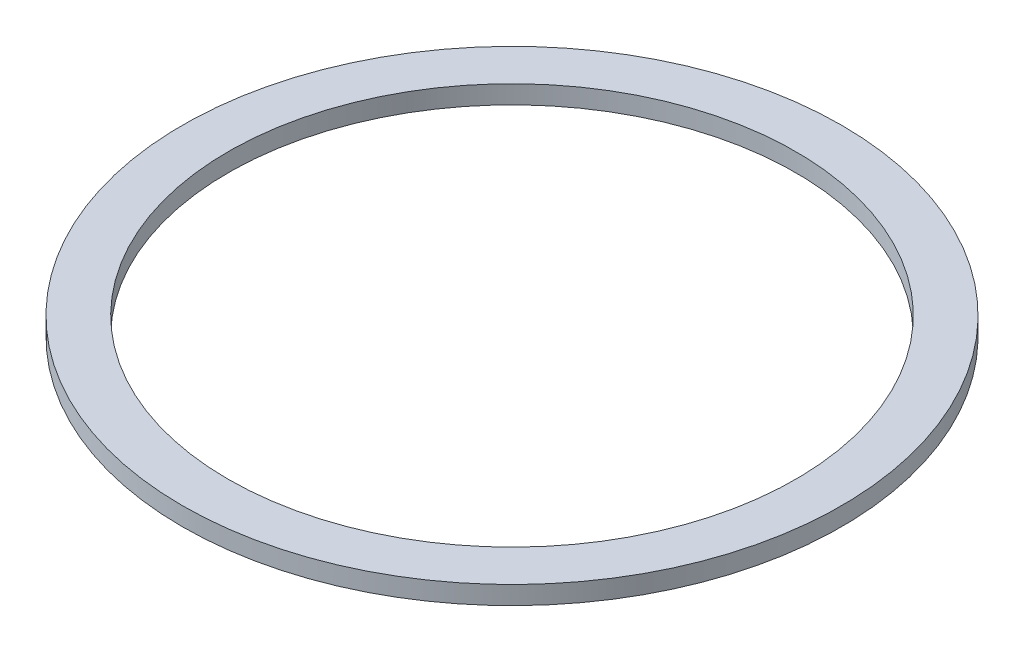
ISO-10303-21;
HEADER;
FILE_DESCRIPTION(('STEP AP214'),'2;1');
FILE_NAME('part.step','',(''),(''),'','','');
FILE_SCHEMA(('AUTOMOTIVE_DESIGN { 1 0 10303 214 1 1 1 1 }'));
ENDSEC;
DATA;
#1=APPLICATION_CONTEXT('core data for automotive mechanical design processes');
#2=APPLICATION_PROTOCOL_DEFINITION('international standard','automotive_design',2000,#1);
#3=PRODUCT_CONTEXT('',#1,'mechanical');
#4=PRODUCT('Part','Part','',(#3));
#5=PRODUCT_RELATED_PRODUCT_CATEGORY('part','',(#4));
#6=PRODUCT_DEFINITION_FORMATION('','',#4);
#7=PRODUCT_DEFINITION_CONTEXT('part definition',#1,'design');
#8=PRODUCT_DEFINITION('design','',#6,#7);
#9=PRODUCT_DEFINITION_SHAPE('','',#8);
#10=(LENGTH_UNIT() NAMED_UNIT(*) SI_UNIT(.MILLI.,.METRE.));
#11=(NAMED_UNIT(*) PLANE_ANGLE_UNIT() SI_UNIT($,.RADIAN.));
#12=(NAMED_UNIT(*) SI_UNIT($,.STERADIAN.) SOLID_ANGLE_UNIT());
#13=UNCERTAINTY_MEASURE_WITH_UNIT(LENGTH_MEASURE(1.E-05),#10,'distance_accuracy_value','');
#14=(GEOMETRIC_REPRESENTATION_CONTEXT(3) GLOBAL_UNCERTAINTY_ASSIGNED_CONTEXT((#13)) GLOBAL_UNIT_ASSIGNED_CONTEXT((#10,
#11,#12)) REPRESENTATION_CONTEXT('',''));
#15=CARTESIAN_POINT('',(0.,0.,0.));
#16=DIRECTION('',(0.,0.,1.));
#17=DIRECTION('',(1.,0.,0.));
#18=AXIS2_PLACEMENT_3D('',#15,#16,#17);
#19=CARTESIAN_POINT('',(0.,1.,0.));
#20=DIRECTION('',(0.,1.,0.));
#21=DIRECTION('',(0.,0.,1.));
#22=AXIS2_PLACEMENT_3D('',#19,#20,#21);
#23=PLANE('',#22);
#24=CARTESIAN_POINT('',(0.,1.,0.));
#25=DIRECTION('',(0.,1.,0.));
#26=DIRECTION('',(0.,0.,1.));
#27=AXIS2_PLACEMENT_3D('',#24,#25,#26);
#28=CIRCLE('',#27,18.);
#29=CARTESIAN_POINT('',(0.,1.,18.));
#30=VERTEX_POINT('',#29);
#31=EDGE_CURVE('E10',#30,#30,#28,.T.);
#32=ORIENTED_EDGE('',*,*,#31,.T.);
#33=EDGE_LOOP('',(#32));
#34=FACE_BOUND('',#33,.T.);
#35=CARTESIAN_POINT('',(0.,1.,0.));
#36=DIRECTION('',(0.,1.,0.));
#37=DIRECTION('',(0.,0.,1.));
#38=AXIS2_PLACEMENT_3D('',#35,#36,#37);
#39=CIRCLE('',#38,15.5);
#40=CARTESIAN_POINT('',(0.,1.,15.5));
#41=VERTEX_POINT('',#40);
#42=EDGE_CURVE('E56',#41,#41,#39,.T.);
#43=ORIENTED_EDGE('',*,*,#42,.F.);
#44=EDGE_LOOP('',(#43));
#45=FACE_BOUND('',#44,.T.);
#46=ADVANCED_FACE('F43',(#34,#45),#23,.T.);
#47=CARTESIAN_POINT('',(0.,0.,0.));
#48=DIRECTION('',(0.,1.,0.));
#49=DIRECTION('',(0.,0.,1.));
#50=AXIS2_PLACEMENT_3D('',#47,#48,#49);
#51=PLANE('',#50);
#52=CARTESIAN_POINT('',(0.,0.,0.));
#53=DIRECTION('',(0.,1.,0.));
#54=DIRECTION('',(0.,0.,1.));
#55=AXIS2_PLACEMENT_3D('',#52,#53,#54);
#56=CIRCLE('',#55,18.);
#57=CARTESIAN_POINT('',(0.,0.,18.));
#58=VERTEX_POINT('',#57);
#59=EDGE_CURVE('E47',#58,#58,#56,.T.);
#60=ORIENTED_EDGE('',*,*,#59,.F.);
#61=EDGE_LOOP('',(#60));
#62=FACE_BOUND('',#61,.T.);
#63=CARTESIAN_POINT('',(0.,0.,0.));
#64=DIRECTION('',(0.,1.,0.));
#65=DIRECTION('',(0.,0.,1.));
#66=AXIS2_PLACEMENT_3D('',#63,#64,#65);
#67=CIRCLE('',#66,15.5);
#68=CARTESIAN_POINT('',(0.,0.,15.5));
#69=VERTEX_POINT('',#68);
#70=EDGE_CURVE('E58',#69,#69,#67,.T.);
#71=ORIENTED_EDGE('',*,*,#70,.T.);
#72=EDGE_LOOP('',(#71));
#73=FACE_BOUND('',#72,.T.);
#74=ADVANCED_FACE('F70',(#62,#73),#51,.F.);
#75=CARTESIAN_POINT('',(0.,1.,0.));
#76=DIRECTION('',(0.,-1.,0.));
#77=DIRECTION('',(0.,0.,-1.));
#78=AXIS2_PLACEMENT_3D('',#75,#76,#77);
#79=CYLINDRICAL_SURFACE('',#78,18.);
#80=ORIENTED_EDGE('',*,*,#31,.F.);
#81=EDGE_LOOP('',(#80));
#82=FACE_BOUND('',#81,.T.);
#83=ORIENTED_EDGE('',*,*,#59,.T.);
#84=EDGE_LOOP('',(#83));
#85=FACE_BOUND('',#84,.T.);
#86=ADVANCED_FACE('F45',(#82,#85),#79,.T.);
#87=CARTESIAN_POINT('',(0.,1.,0.));
#88=DIRECTION('',(0.,-1.,0.));
#89=DIRECTION('',(0.,0.,-1.));
#90=AXIS2_PLACEMENT_3D('',#87,#88,#89);
#91=CYLINDRICAL_SURFACE('',#90,15.5);
#92=ORIENTED_EDGE('',*,*,#42,.T.);
#93=EDGE_LOOP('',(#92));
#94=FACE_BOUND('',#93,.T.);
#95=ORIENTED_EDGE('',*,*,#70,.F.);
#96=EDGE_LOOP('',(#95));
#97=FACE_BOUND('',#96,.T.);
#98=ADVANCED_FACE('F66',(#94,#97),#91,.F.);
#99=CLOSED_SHELL('',(#46,#74,#86,#98));
#100=MANIFOLD_SOLID_BREP('B2',#99);
#101=ADVANCED_BREP_SHAPE_REPRESENTATION('',(#18,#100),#14);
#102=SHAPE_DEFINITION_REPRESENTATION(#9,#101);
ENDSEC;
END-ISO-10303-21;
